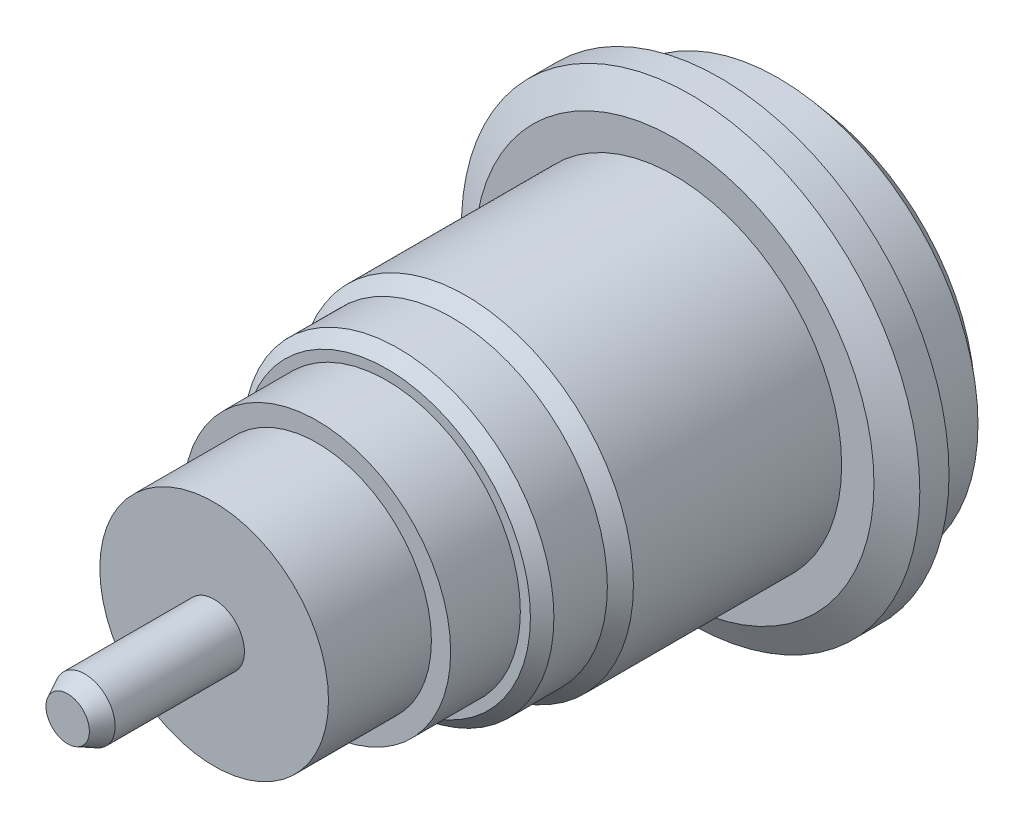
ISO-10303-21;
HEADER;
FILE_DESCRIPTION(('STEP AP214'),'2;1');
FILE_NAME('part.step','',(''),(''),'','','');
FILE_SCHEMA(('AUTOMOTIVE_DESIGN { 1 0 10303 214 1 1 1 1 }'));
ENDSEC;
DATA;
#1=APPLICATION_CONTEXT('core data for automotive mechanical design processes');
#2=APPLICATION_PROTOCOL_DEFINITION('international standard','automotive_design',2000,#1);
#3=PRODUCT_CONTEXT('',#1,'mechanical');
#4=PRODUCT('Part','Part','',(#3));
#5=PRODUCT_RELATED_PRODUCT_CATEGORY('part','',(#4));
#6=PRODUCT_DEFINITION_FORMATION('','',#4);
#7=PRODUCT_DEFINITION_CONTEXT('part definition',#1,'design');
#8=PRODUCT_DEFINITION('design','',#6,#7);
#9=PRODUCT_DEFINITION_SHAPE('','',#8);
#10=(LENGTH_UNIT() NAMED_UNIT(*) SI_UNIT(.MILLI.,.METRE.));
#11=(NAMED_UNIT(*) PLANE_ANGLE_UNIT() SI_UNIT($,.RADIAN.));
#12=(NAMED_UNIT(*) SI_UNIT($,.STERADIAN.) SOLID_ANGLE_UNIT());
#13=UNCERTAINTY_MEASURE_WITH_UNIT(LENGTH_MEASURE(1.E-05),#10,'distance_accuracy_value','');
#14=(GEOMETRIC_REPRESENTATION_CONTEXT(3) GLOBAL_UNCERTAINTY_ASSIGNED_CONTEXT((#13)) GLOBAL_UNIT_ASSIGNED_CONTEXT((#10,
#11,#12)) REPRESENTATION_CONTEXT('',''));
#15=CARTESIAN_POINT('',(0.,0.,0.));
#16=DIRECTION('',(0.,0.,1.));
#17=DIRECTION('',(1.,0.,0.));
#18=AXIS2_PLACEMENT_3D('',#15,#16,#17);
#19=CARTESIAN_POINT('',(8.48433946662404,0.,4.06635487942796));
#20=DIRECTION('',(0.,0.,-1.));
#21=DIRECTION('',(-1.,0.,0.));
#22=AXIS2_PLACEMENT_3D('',#19,#20,#21);
#23=PLANE('',#22);
#24=CARTESIAN_POINT('',(0.,0.,4.06635487942796));
#25=DIRECTION('',(0.,0.,-1.));
#26=DIRECTION('',(-1.,0.,0.));
#27=AXIS2_PLACEMENT_3D('',#24,#25,#26);
#28=CIRCLE('',#27,6.86481711667044);
#29=CARTESIAN_POINT('',(-6.86481711667044,0.,4.06635487942796));
#30=VERTEX_POINT('',#29);
#31=EDGE_CURVE('E94',#30,#30,#28,.T.);
#32=ORIENTED_EDGE('',*,*,#31,.F.);
#33=EDGE_LOOP('',(#32));
#34=FACE_BOUND('',#33,.T.);
#35=CARTESIAN_POINT('',(0.,0.,4.06635487942796));
#36=DIRECTION('',(0.,0.,1.));
#37=DIRECTION('',(1.,0.,0.));
#38=AXIS2_PLACEMENT_3D('',#35,#36,#37);
#39=CIRCLE('',#38,8.48433946662404);
#40=CARTESIAN_POINT('',(8.48433946662404,0.,4.06635487942796));
#41=VERTEX_POINT('',#40);
#42=EDGE_CURVE('E10',#41,#41,#39,.T.);
#43=ORIENTED_EDGE('',*,*,#42,.F.);
#44=EDGE_LOOP('',(#43));
#45=FACE_BOUND('',#44,.T.);
#46=ADVANCED_FACE('F32',(#34,#45),#23,.T.);
#47=CARTESIAN_POINT('',(0.,1.03736276561651,38.9319607545086));
#48=DIRECTION('',(0.,0.,-1.));
#49=DIRECTION('',(-1.,0.,0.));
#50=AXIS2_PLACEMENT_3D('',#47,#48,#49);
#51=PLANE('',#50);
#52=CARTESIAN_POINT('',(0.,0.,38.9319607545086));
#53=DIRECTION('',(0.,0.,1.));
#54=DIRECTION('',(1.,0.,0.));
#55=AXIS2_PLACEMENT_3D('',#52,#53,#54);
#56=CIRCLE('',#55,1.03736276561651);
#57=CARTESIAN_POINT('',(1.03736276561651,0.,38.9319607545086));
#58=VERTEX_POINT('',#57);
#59=EDGE_CURVE('E90',#58,#58,#56,.T.);
#60=ORIENTED_EDGE('',*,*,#59,.T.);
#61=EDGE_LOOP('',(#60));
#62=FACE_BOUND('',#61,.T.);
#63=ADVANCED_FACE('F111',(#62),#51,.F.);
#64=CARTESIAN_POINT('',(0.,0.,38.1113480464627));
#65=DIRECTION('',(0.,0.,-1.));
#66=DIRECTION('',(-1.,0.,0.));
#67=AXIS2_PLACEMENT_3D('',#64,#65,#66);
#68=CONICAL_SURFACE('',#67,1.44745658348096,0.4634403900054);
#69=ORIENTED_EDGE('',*,*,#59,.F.);
#70=EDGE_LOOP('',(#69));
#71=FACE_BOUND('',#70,.T.);
#72=CARTESIAN_POINT('',(0.,0.,38.1113480464627));
#73=DIRECTION('',(0.,0.,1.));
#74=DIRECTION('',(1.,0.,0.));
#75=AXIS2_PLACEMENT_3D('',#72,#73,#74);
#76=CIRCLE('',#75,1.44745658348096);
#77=CARTESIAN_POINT('',(1.44745658348096,0.,38.1113480464627));
#78=VERTEX_POINT('',#77);
#79=EDGE_CURVE('E87',#78,#78,#76,.T.);
#80=ORIENTED_EDGE('',*,*,#79,.T.);
#81=EDGE_LOOP('',(#80));
#82=FACE_BOUND('',#81,.T.);
#83=ADVANCED_FACE('F115',(#71,#82),#68,.T.);
#84=CARTESIAN_POINT('',(0.,0.,38.9319607545086));
#85=DIRECTION('',(0.,0.,1.));
#86=DIRECTION('',(1.,0.,0.));
#87=AXIS2_PLACEMENT_3D('',#84,#85,#86);
#88=CYLINDRICAL_SURFACE('',#87,1.44745658348096);
#89=ORIENTED_EDGE('',*,*,#79,.F.);
#90=EDGE_LOOP('',(#89));
#91=FACE_BOUND('',#90,.T.);
#92=CARTESIAN_POINT('',(0.,0.,31.9319607545086));
#93=DIRECTION('',(0.,0.,1.));
#94=DIRECTION('',(1.,0.,0.));
#95=AXIS2_PLACEMENT_3D('',#92,#93,#94);
#96=CIRCLE('',#95,1.44745658348096);
#97=CARTESIAN_POINT('',(1.44745658348096,0.,31.9319607545086));
#98=VERTEX_POINT('',#97);
#99=EDGE_CURVE('E84',#98,#98,#96,.T.);
#100=ORIENTED_EDGE('',*,*,#99,.T.);
#101=EDGE_LOOP('',(#100));
#102=FACE_BOUND('',#101,.T.);
#103=ADVANCED_FACE('F178',(#91,#102),#88,.T.);
#104=CARTESIAN_POINT('',(0.,5.46423865815507,31.9319607545086));
#105=DIRECTION('',(0.,0.,-1.));
#106=DIRECTION('',(-1.,0.,0.));
#107=AXIS2_PLACEMENT_3D('',#104,#105,#106);
#108=PLANE('',#107);
#109=ORIENTED_EDGE('',*,*,#99,.F.);
#110=EDGE_LOOP('',(#109));
#111=FACE_BOUND('',#110,.T.);
#112=CARTESIAN_POINT('',(0.,0.,31.9319607545086));
#113=DIRECTION('',(0.,0.,1.));
#114=DIRECTION('',(1.,0.,0.));
#115=AXIS2_PLACEMENT_3D('',#112,#113,#114);
#116=CIRCLE('',#115,5.46423865815507);
#117=CARTESIAN_POINT('',(5.46423865815507,0.,31.9319607545086));
#118=VERTEX_POINT('',#117);
#119=EDGE_CURVE('E81',#118,#118,#116,.T.);
#120=ORIENTED_EDGE('',*,*,#119,.T.);
#121=EDGE_LOOP('',(#120));
#122=FACE_BOUND('',#121,.T.);
#123=ADVANCED_FACE('F174',(#111,#122),#108,.F.);
#124=CARTESIAN_POINT('',(0.,0.,38.9319607545086));
#125=DIRECTION('',(0.,0.,1.));
#126=DIRECTION('',(1.,0.,0.));
#127=AXIS2_PLACEMENT_3D('',#124,#125,#126);
#128=CYLINDRICAL_SURFACE('',#127,5.46423865815507);
#129=ORIENTED_EDGE('',*,*,#119,.F.);
#130=EDGE_LOOP('',(#129));
#131=FACE_BOUND('',#130,.T.);
#132=CARTESIAN_POINT('',(0.,0.,27.0133813003564));
#133=DIRECTION('',(0.,0.,1.));
#134=DIRECTION('',(1.,0.,0.));
#135=AXIS2_PLACEMENT_3D('',#132,#133,#134);
#136=CIRCLE('',#135,5.46423865815507);
#137=CARTESIAN_POINT('',(5.46423865815507,0.,27.0133813003564));
#138=VERTEX_POINT('',#137);
#139=EDGE_CURVE('E78',#138,#138,#136,.T.);
#140=ORIENTED_EDGE('',*,*,#139,.T.);
#141=EDGE_LOOP('',(#140));
#142=FACE_BOUND('',#141,.T.);
#143=ADVANCED_FACE('F170',(#131,#142),#128,.T.);
#144=CARTESIAN_POINT('',(0.,6.38353732374643,27.0133813003564));
#145=DIRECTION('',(0.,0.,-1.));
#146=DIRECTION('',(-1.,0.,0.));
#147=AXIS2_PLACEMENT_3D('',#144,#145,#146);
#148=PLANE('',#147);
#149=ORIENTED_EDGE('',*,*,#139,.F.);
#150=EDGE_LOOP('',(#149));
#151=FACE_BOUND('',#150,.T.);
#152=CARTESIAN_POINT('',(0.,0.,27.0133813003564));
#153=DIRECTION('',(0.,0.,1.));
#154=DIRECTION('',(1.,0.,0.));
#155=AXIS2_PLACEMENT_3D('',#152,#153,#154);
#156=CIRCLE('',#155,6.38353732374643);
#157=CARTESIAN_POINT('',(6.38353732374643,0.,27.0133813003564));
#158=VERTEX_POINT('',#157);
#159=EDGE_CURVE('E75',#158,#158,#156,.T.);
#160=ORIENTED_EDGE('',*,*,#159,.T.);
#161=EDGE_LOOP('',(#160));
#162=FACE_BOUND('',#161,.T.);
#163=ADVANCED_FACE('F166',(#151,#162),#148,.F.);
#164=CARTESIAN_POINT('',(0.,0.,38.9319607545086));
#165=DIRECTION('',(0.,0.,1.));
#166=DIRECTION('',(1.,0.,0.));
#167=AXIS2_PLACEMENT_3D('',#164,#165,#166);
#168=CYLINDRICAL_SURFACE('',#167,6.38353732374643);
#169=ORIENTED_EDGE('',*,*,#159,.F.);
#170=EDGE_LOOP('',(#169));
#171=FACE_BOUND('',#170,.T.);
#172=CARTESIAN_POINT('',(0.,0.,23.6826250716606));
#173=DIRECTION('',(0.,0.,1.));
#174=DIRECTION('',(1.,0.,0.));
#175=AXIS2_PLACEMENT_3D('',#172,#173,#174);
#176=CIRCLE('',#175,6.38353732374643);
#177=CARTESIAN_POINT('',(6.38353732374643,0.,23.6826250716606));
#178=VERTEX_POINT('',#177);
#179=EDGE_CURVE('E72',#178,#178,#176,.T.);
#180=ORIENTED_EDGE('',*,*,#179,.T.);
#181=EDGE_LOOP('',(#180));
#182=FACE_BOUND('',#181,.T.);
#183=ADVANCED_FACE('F162',(#171,#182),#168,.T.);
#184=CARTESIAN_POINT('',(0.,6.86481711667044,23.6826250716606));
#185=DIRECTION('',(0.,0.,-1.));
#186=DIRECTION('',(-1.,0.,0.));
#187=AXIS2_PLACEMENT_3D('',#184,#185,#186);
#188=PLANE('',#187);
#189=ORIENTED_EDGE('',*,*,#179,.F.);
#190=EDGE_LOOP('',(#189));
#191=FACE_BOUND('',#190,.T.);
#192=CARTESIAN_POINT('',(0.,0.,23.6826250716606));
#193=DIRECTION('',(0.,0.,1.));
#194=DIRECTION('',(1.,0.,0.));
#195=AXIS2_PLACEMENT_3D('',#192,#193,#194);
#196=CIRCLE('',#195,6.86481711667044);
#197=CARTESIAN_POINT('',(6.86481711667044,0.,23.6826250716606));
#198=VERTEX_POINT('',#197);
#199=EDGE_CURVE('E69',#198,#198,#196,.T.);
#200=ORIENTED_EDGE('',*,*,#199,.T.);
#201=EDGE_LOOP('',(#200));
#202=FACE_BOUND('',#201,.T.);
#203=ADVANCED_FACE('F158',(#191,#202),#188,.F.);
#204=CARTESIAN_POINT('',(0.,0.,23.1214405574749));
#205=DIRECTION('',(0.,0.,-1.));
#206=DIRECTION('',(-1.,0.,0.));
#207=AXIS2_PLACEMENT_3D('',#204,#205,#206);
#208=CONICAL_SURFACE('',#207,7.42600163085606,0.785398163397449);
#209=ORIENTED_EDGE('',*,*,#199,.F.);
#210=EDGE_LOOP('',(#209));
#211=FACE_BOUND('',#210,.T.);
#212=CARTESIAN_POINT('',(0.,0.,23.1214405574749));
#213=DIRECTION('',(0.,0.,1.));
#214=DIRECTION('',(1.,0.,0.));
#215=AXIS2_PLACEMENT_3D('',#212,#213,#214);
#216=CIRCLE('',#215,7.42600163085606);
#217=CARTESIAN_POINT('',(7.42600163085606,0.,23.1214405574749));
#218=VERTEX_POINT('',#217);
#219=EDGE_CURVE('E66',#218,#218,#216,.T.);
#220=ORIENTED_EDGE('',*,*,#219,.T.);
#221=EDGE_LOOP('',(#220));
#222=FACE_BOUND('',#221,.T.);
#223=ADVANCED_FACE('F154',(#211,#222),#208,.T.);
#224=CARTESIAN_POINT('',(0.,0.,38.9319607545086));
#225=DIRECTION('',(0.,0.,1.));
#226=DIRECTION('',(1.,0.,0.));
#227=AXIS2_PLACEMENT_3D('',#224,#225,#226);
#228=CYLINDRICAL_SURFACE('',#227,7.42600163085606);
#229=ORIENTED_EDGE('',*,*,#219,.F.);
#230=EDGE_LOOP('',(#229));
#231=FACE_BOUND('',#230,.T.);
#232=CARTESIAN_POINT('',(0.,0.,20.566354879428));
#233=DIRECTION('',(0.,0.,1.));
#234=DIRECTION('',(1.,0.,0.));
#235=AXIS2_PLACEMENT_3D('',#232,#233,#234);
#236=CIRCLE('',#235,7.42600163085606);
#237=CARTESIAN_POINT('',(7.42600163085606,0.,20.566354879428));
#238=VERTEX_POINT('',#237);
#239=EDGE_CURVE('E63',#238,#238,#236,.T.);
#240=ORIENTED_EDGE('',*,*,#239,.T.);
#241=EDGE_LOOP('',(#240));
#242=FACE_BOUND('',#241,.T.);
#243=ADVANCED_FACE('F150',(#231,#242),#228,.T.);
#244=CARTESIAN_POINT('',(0.,0.,19.8960534388679));
#245=DIRECTION('',(0.,0.,-1.));
#246=DIRECTION('',(-1.,0.,0.));
#247=AXIS2_PLACEMENT_3D('',#244,#245,#246);
#248=CONICAL_SURFACE('',#247,8.,0.708156752464448);
#249=ORIENTED_EDGE('',*,*,#239,.F.);
#250=EDGE_LOOP('',(#249));
#251=FACE_BOUND('',#250,.T.);
#252=CARTESIAN_POINT('',(0.,0.,19.8960534388679));
#253=DIRECTION('',(0.,0.,1.));
#254=DIRECTION('',(1.,0.,0.));
#255=AXIS2_PLACEMENT_3D('',#252,#253,#254);
#256=CIRCLE('',#255,8.);
#257=CARTESIAN_POINT('',(8.,0.,19.8960534388679));
#258=VERTEX_POINT('',#257);
#259=EDGE_CURVE('E60',#258,#258,#256,.T.);
#260=ORIENTED_EDGE('',*,*,#259,.T.);
#261=EDGE_LOOP('',(#260));
#262=FACE_BOUND('',#261,.T.);
#263=ADVANCED_FACE('F146',(#251,#262),#248,.T.);
#264=CARTESIAN_POINT('',(0.,0.,38.9319607545086));
#265=DIRECTION('',(0.,0.,1.));
#266=DIRECTION('',(1.,0.,0.));
#267=AXIS2_PLACEMENT_3D('',#264,#265,#266);
#268=CYLINDRICAL_SURFACE('',#267,8.);
#269=ORIENTED_EDGE('',*,*,#259,.F.);
#270=EDGE_LOOP('',(#269));
#271=FACE_BOUND('',#270,.T.);
#272=CARTESIAN_POINT('',(0.,0.,9.94587625142915));
#273=DIRECTION('',(0.,0.,1.));
#274=DIRECTION('',(1.,0.,0.));
#275=AXIS2_PLACEMENT_3D('',#272,#273,#274);
#276=CIRCLE('',#275,8.);
#277=CARTESIAN_POINT('',(8.,0.,9.94587625142915));
#278=VERTEX_POINT('',#277);
#279=EDGE_CURVE('E57',#278,#278,#276,.T.);
#280=ORIENTED_EDGE('',*,*,#279,.T.);
#281=EDGE_LOOP('',(#280));
#282=FACE_BOUND('',#281,.T.);
#283=ADVANCED_FACE('F142',(#271,#282),#268,.T.);
#284=CARTESIAN_POINT('',(0.,9.54615499728726,9.94587625142916));
#285=DIRECTION('',(0.,0.,-1.));
#286=DIRECTION('',(-1.,0.,0.));
#287=AXIS2_PLACEMENT_3D('',#284,#285,#286);
#288=PLANE('',#287);
#289=ORIENTED_EDGE('',*,*,#279,.F.);
#290=EDGE_LOOP('',(#289));
#291=FACE_BOUND('',#290,.T.);
#292=CARTESIAN_POINT('',(0.,0.,9.94587625142915));
#293=DIRECTION('',(0.,0.,1.));
#294=DIRECTION('',(1.,0.,0.));
#295=AXIS2_PLACEMENT_3D('',#292,#293,#294);
#296=CIRCLE('',#295,9.54615499728726);
#297=CARTESIAN_POINT('',(9.54615499728726,0.,9.94587625142915));
#298=VERTEX_POINT('',#297);
#299=EDGE_CURVE('E54',#298,#298,#296,.T.);
#300=ORIENTED_EDGE('',*,*,#299,.T.);
#301=EDGE_LOOP('',(#300));
#302=FACE_BOUND('',#301,.T.);
#303=ADVANCED_FACE('F138',(#291,#302),#288,.F.);
#304=CARTESIAN_POINT('',(0.,0.,9.16403787558949));
#305=DIRECTION('',(0.,0.,-1.));
#306=DIRECTION('',(-1.,0.,0.));
#307=AXIS2_PLACEMENT_3D('',#304,#305,#306);
#308=CONICAL_SURFACE('',#307,10.9541934290143,1.06391775230719);
#309=ORIENTED_EDGE('',*,*,#299,.F.);
#310=EDGE_LOOP('',(#309));
#311=FACE_BOUND('',#310,.T.);
#312=CARTESIAN_POINT('',(0.,0.,9.16403787558949));
#313=DIRECTION('',(0.,0.,1.));
#314=DIRECTION('',(1.,0.,0.));
#315=AXIS2_PLACEMENT_3D('',#312,#313,#314);
#316=CIRCLE('',#315,10.9541934290143);
#317=CARTESIAN_POINT('',(10.9541934290143,0.,9.16403787558949));
#318=VERTEX_POINT('',#317);
#319=EDGE_CURVE('E51',#318,#318,#316,.T.);
#320=ORIENTED_EDGE('',*,*,#319,.T.);
#321=EDGE_LOOP('',(#320));
#322=FACE_BOUND('',#321,.T.);
#323=ADVANCED_FACE('F134',(#311,#322),#308,.T.);
#324=CARTESIAN_POINT('',(0.,0.,38.9319607545086));
#325=DIRECTION('',(0.,0.,1.));
#326=DIRECTION('',(1.,0.,0.));
#327=AXIS2_PLACEMENT_3D('',#324,#325,#326);
#328=CYLINDRICAL_SURFACE('',#327,10.9541934290143);
#329=ORIENTED_EDGE('',*,*,#319,.F.);
#330=EDGE_LOOP('',(#329));
#331=FACE_BOUND('',#330,.T.);
#332=CARTESIAN_POINT('',(0.,0.,7.76789791873294));
#333=DIRECTION('',(0.,0.,1.));
#334=DIRECTION('',(1.,0.,0.));
#335=AXIS2_PLACEMENT_3D('',#332,#333,#334);
#336=CIRCLE('',#335,10.9541934290143);
#337=CARTESIAN_POINT('',(10.9541934290143,0.,7.76789791873294));
#338=VERTEX_POINT('',#337);
#339=EDGE_CURVE('E46',#338,#338,#336,.T.);
#340=ORIENTED_EDGE('',*,*,#339,.T.);
#341=EDGE_LOOP('',(#340));
#342=FACE_BOUND('',#341,.T.);
#343=ADVANCED_FACE('F130',(#331,#342),#328,.T.);
#344=CARTESIAN_POINT('',(0.,0.,7.06424338047723));
#345=DIRECTION('',(0.,0.,1.));
#346=DIRECTION('',(1.,0.,0.));
#347=AXIS2_PLACEMENT_3D('',#344,#345,#346);
#348=CONICAL_SURFACE('',#347,9.54615499728726,1.1073559367895);
#349=ORIENTED_EDGE('',*,*,#339,.F.);
#350=EDGE_LOOP('',(#349));
#351=FACE_BOUND('',#350,.T.);
#352=CARTESIAN_POINT('',(0.,0.,7.06424338047723));
#353=DIRECTION('',(0.,0.,1.));
#354=DIRECTION('',(1.,0.,0.));
#355=AXIS2_PLACEMENT_3D('',#352,#353,#354);
#356=CIRCLE('',#355,9.54615499728726);
#357=CARTESIAN_POINT('',(9.54615499728726,0.,7.06424338047723));
#358=VERTEX_POINT('',#357);
#359=EDGE_CURVE('E42',#358,#358,#356,.T.);
#360=ORIENTED_EDGE('',*,*,#359,.T.);
#361=EDGE_LOOP('',(#360));
#362=FACE_BOUND('',#361,.T.);
#363=ADVANCED_FACE('F124',(#351,#362),#348,.T.);
#364=CARTESIAN_POINT('',(0.,0.,38.9319607545086));
#365=DIRECTION('',(0.,0.,1.));
#366=DIRECTION('',(1.,0.,0.));
#367=AXIS2_PLACEMENT_3D('',#364,#365,#366);
#368=CYLINDRICAL_SURFACE('',#367,9.54615499728726);
#369=ORIENTED_EDGE('',*,*,#359,.F.);
#370=EDGE_LOOP('',(#369));
#371=FACE_BOUND('',#370,.T.);
#372=CARTESIAN_POINT('',(0.,0.,4.97561800501983));
#373=DIRECTION('',(0.,0.,1.));
#374=DIRECTION('',(1.,0.,0.));
#375=AXIS2_PLACEMENT_3D('',#372,#373,#374);
#376=CIRCLE('',#375,9.54615499728726);
#377=CARTESIAN_POINT('',(9.54615499728726,0.,4.97561800501983));
#378=VERTEX_POINT('',#377);
#379=EDGE_CURVE('E38',#378,#378,#376,.T.);
#380=ORIENTED_EDGE('',*,*,#379,.T.);
#381=EDGE_LOOP('',(#380));
#382=FACE_BOUND('',#381,.T.);
#383=ADVANCED_FACE('F119',(#371,#382),#368,.T.);
#384=CARTESIAN_POINT('',(0.,0.,4.06635487942796));
#385=DIRECTION('',(0.,0.,1.));
#386=DIRECTION('',(1.,0.,0.));
#387=AXIS2_PLACEMENT_3D('',#384,#385,#386);
#388=CONICAL_SURFACE('',#387,8.48433946662404,0.862639574330448);
#389=ORIENTED_EDGE('',*,*,#379,.F.);
#390=EDGE_LOOP('',(#389));
#391=FACE_BOUND('',#390,.T.);
#392=ORIENTED_EDGE('',*,*,#42,.T.);
#393=EDGE_LOOP('',(#392));
#394=FACE_BOUND('',#393,.T.);
#395=ADVANCED_FACE('F105',(#391,#394),#388,.T.);
#396=CARTESIAN_POINT('',(0.,0.,7.36635487942796));
#397=DIRECTION('',(0.,0.,-1.));
#398=DIRECTION('',(-1.,0.,0.));
#399=AXIS2_PLACEMENT_3D('',#396,#397,#398);
#400=CYLINDRICAL_SURFACE('',#399,6.86481711667044);
#401=CARTESIAN_POINT('',(0.,0.,7.36635487942796));
#402=DIRECTION('',(0.,0.,-1.));
#403=DIRECTION('',(-1.,0.,0.));
#404=AXIS2_PLACEMENT_3D('',#401,#402,#403);
#405=CIRCLE('',#404,6.86481711667044);
#406=CARTESIAN_POINT('',(-6.86481711667044,0.,7.36635487942796));
#407=VERTEX_POINT('',#406);
#408=EDGE_CURVE('E93',#407,#407,#405,.T.);
#409=ORIENTED_EDGE('',*,*,#408,.F.);
#410=EDGE_LOOP('',(#409));
#411=FACE_BOUND('',#410,.T.);
#412=ORIENTED_EDGE('',*,*,#31,.T.);
#413=EDGE_LOOP('',(#412));
#414=FACE_BOUND('',#413,.T.);
#415=ADVANCED_FACE('F102',(#411,#414),#400,.F.);
#416=CARTESIAN_POINT('',(0.,0.,7.36635487942796));
#417=DIRECTION('',(0.,0.,-1.));
#418=DIRECTION('',(-1.,0.,0.));
#419=AXIS2_PLACEMENT_3D('',#416,#417,#418);
#420=PLANE('',#419);
#421=ORIENTED_EDGE('',*,*,#408,.T.);
#422=EDGE_LOOP('',(#421));
#423=FACE_BOUND('',#422,.T.);
#424=ADVANCED_FACE('F100',(#423),#420,.T.);
#425=CLOSED_SHELL('',(#46,#63,#83,#103,#123,#143,#163,#183,#203,#223,#243,#263,#283,#303,#323,
#343,#363,#383,#395,#415,#424));
#426=MANIFOLD_SOLID_BREP('B2',#425);
#427=ADVANCED_BREP_SHAPE_REPRESENTATION('',(#18,#426),#14);
#428=SHAPE_DEFINITION_REPRESENTATION(#9,#427);
ENDSEC;
END-ISO-10303-21;
